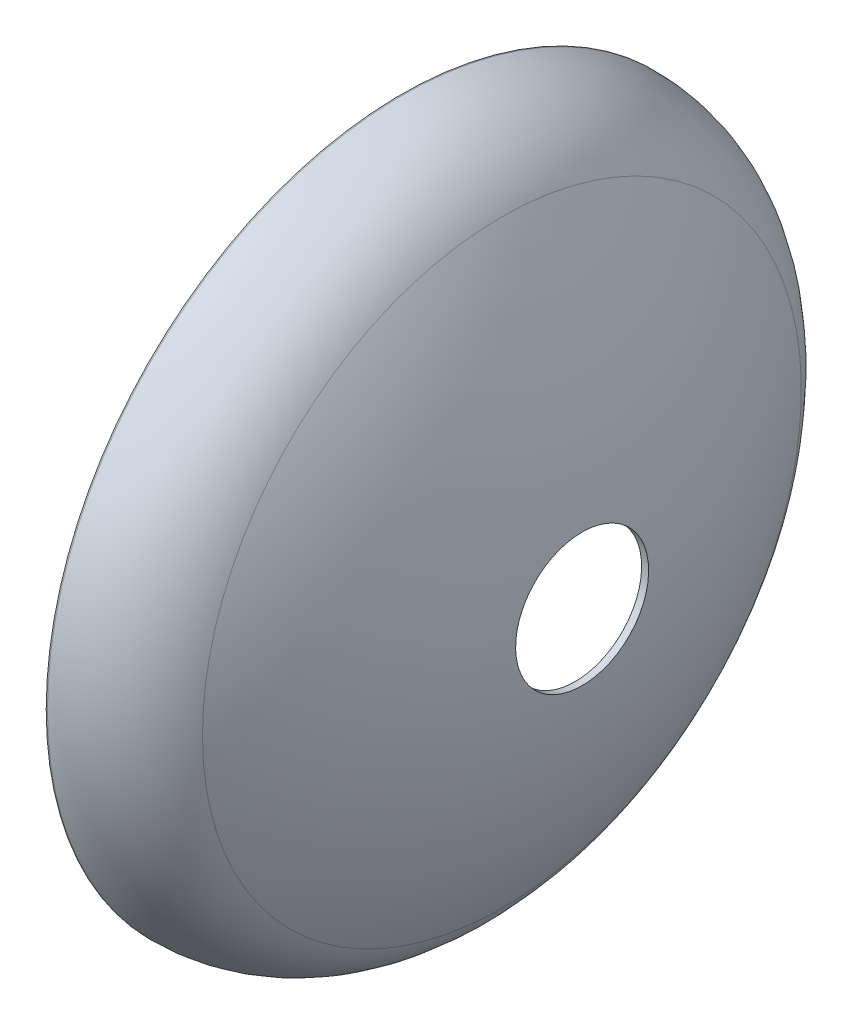
ISO-10303-21;
HEADER;
FILE_DESCRIPTION(('STEP AP214'),'2;1');
FILE_NAME('part.step','',(''),(''),'','','');
FILE_SCHEMA(('AUTOMOTIVE_DESIGN { 1 0 10303 214 1 1 1 1 }'));
ENDSEC;
DATA;
#1=APPLICATION_CONTEXT('core data for automotive mechanical design processes');
#2=APPLICATION_PROTOCOL_DEFINITION('international standard','automotive_design',2000,#1);
#3=PRODUCT_CONTEXT('',#1,'mechanical');
#4=PRODUCT('Part','Part','',(#3));
#5=PRODUCT_RELATED_PRODUCT_CATEGORY('part','',(#4));
#6=PRODUCT_DEFINITION_FORMATION('','',#4);
#7=PRODUCT_DEFINITION_CONTEXT('part definition',#1,'design');
#8=PRODUCT_DEFINITION('design','',#6,#7);
#9=PRODUCT_DEFINITION_SHAPE('','',#8);
#10=(LENGTH_UNIT() NAMED_UNIT(*) SI_UNIT(.MILLI.,.METRE.));
#11=(NAMED_UNIT(*) PLANE_ANGLE_UNIT() SI_UNIT($,.RADIAN.));
#12=(NAMED_UNIT(*) SI_UNIT($,.STERADIAN.) SOLID_ANGLE_UNIT());
#13=UNCERTAINTY_MEASURE_WITH_UNIT(LENGTH_MEASURE(1.E-05),#10,'distance_accuracy_value','');
#14=(GEOMETRIC_REPRESENTATION_CONTEXT(3) GLOBAL_UNCERTAINTY_ASSIGNED_CONTEXT((#13)) GLOBAL_UNIT_ASSIGNED_CONTEXT((#10,
#11,#12)) REPRESENTATION_CONTEXT('',''));
#15=CARTESIAN_POINT('',(0.,0.,0.));
#16=DIRECTION('',(0.,0.,1.));
#17=DIRECTION('',(1.,0.,0.));
#18=AXIS2_PLACEMENT_3D('',#15,#16,#17);
#19=CARTESIAN_POINT('',(0.348765499158729,0.,0.));
#20=DIRECTION('',(-1.,0.,0.));
#21=DIRECTION('',(0.,0.,1.));
#22=AXIS2_PLACEMENT_3D('',#19,#20,#21);
#23=TOROIDAL_SURFACE('',#22,68.6153846153846,31.3846153846154);
#24=CARTESIAN_POINT('',(27.146090618006,0.,0.));
#25=DIRECTION('',(-1.,0.,0.));
#26=DIRECTION('',(0.,0.,1.));
#27=AXIS2_PLACEMENT_3D('',#24,#25,#26);
#28=CIRCLE('',#27,84.9523809523809);
#29=CARTESIAN_POINT('',(27.146090618006,84.952380952381,0.));
#30=VERTEX_POINT('',#29);
#31=EDGE_CURVE('E10',#30,#30,#28,.T.);
#32=ORIENTED_EDGE('',*,*,#31,.F.);
#33=EDGE_LOOP('',(#32));
#34=FACE_BOUND('',#33,.T.);
#35=CARTESIAN_POINT('',(0.348765499158729,0.,0.));
#36=DIRECTION('',(-1.,0.,0.));
#37=DIRECTION('',(0.,0.,1.));
#38=AXIS2_PLACEMENT_3D('',#35,#36,#37);
#39=CIRCLE('',#38,100.);
#40=CARTESIAN_POINT('',(0.348765499158729,0.,100.));
#41=VERTEX_POINT('',#40);
#42=EDGE_CURVE('E65',#41,#41,#39,.T.);
#43=ORIENTED_EDGE('',*,*,#42,.T.);
#44=EDGE_LOOP('',(#43));
#45=FACE_BOUND('',#44,.T.);
#46=ADVANCED_FACE('F37',(#34,#45),#23,.F.);
#47=CARTESIAN_POINT('',(-112.2,0.,0.));
#48=DIRECTION('',(-1.,0.,0.));
#49=DIRECTION('',(0.,1.,0.));
#50=AXIS2_PLACEMENT_3D('',#47,#48,#49);
#51=SPHERICAL_SURFACE('',#50,163.2);
#52=CARTESIAN_POINT('',(49.8784686502189,0.,0.));
#53=DIRECTION('',(-1.,0.,0.));
#54=DIRECTION('',(0.,0.,1.));
#55=AXIS2_PLACEMENT_3D('',#52,#53,#54);
#56=CIRCLE('',#55,19.1);
#57=CARTESIAN_POINT('',(49.8784686502189,19.1000000000002,0.));
#58=VERTEX_POINT('',#57);
#59=EDGE_CURVE('E43',#58,#58,#56,.T.);
#60=CARTESIAN_POINT('',(49.8784686502189,19.1000000000002,0.));
#61=CARTESIAN_POINT('',(49.7928806849767,19.8262836858726,0.));
#62=CARTESIAN_POINT('',(49.7024103154685,20.5519920014663,0.));
#63=CARTESIAN_POINT('',(49.5117225066272,22.0021269272937,0.));
#64=CARTESIAN_POINT('',(49.4115050672941,22.7265535375276,0.));
#65=CARTESIAN_POINT('',(49.2013408575101,24.1739940878335,0.));
#66=CARTESIAN_POINT('',(49.0913940870591,24.8970080279055,0.));
#67=CARTESIAN_POINT('',(48.8617911839781,26.3414925904424,0.));
#68=CARTESIAN_POINT('',(48.7421350513479,27.0629632129072,0.));
#69=CARTESIAN_POINT('',(48.4931350210225,28.5042307550573,0.));
#70=CARTESIAN_POINT('',(48.3637911233272,29.2240276747426,0.));
#71=CARTESIAN_POINT('',(48.0954389446111,30.6618177330828,0.));
#72=CARTESIAN_POINT('',(47.9564306635903,31.3798108717379,0.));
#73=CARTESIAN_POINT('',(47.6687748373969,32.8138636145462,0.));
#74=CARTESIAN_POINT('',(47.5201272922243,33.5299232186994,0.));
#75=CARTESIAN_POINT('',(47.2132198013079,34.959979488774,0.));
#76=CARTESIAN_POINT('',(47.0549598555642,35.6739761546954,0.));
#77=CARTESIAN_POINT('',(46.7288561635541,37.0997775172975,0.));
#78=CARTESIAN_POINT('',(46.5610124172878,37.8115822139783,0.));
#79=CARTESIAN_POINT('',(46.2157714564065,39.2328710032384,0.));
#80=CARTESIAN_POINT('',(46.0383742417916,39.9423550958178,0.));
#81=CARTESIAN_POINT('',(45.6740584028102,41.3588744613798,0.));
#82=CARTESIAN_POINT('',(45.4871397784437,42.0659097343624,0.));
#83=CARTESIAN_POINT('',(45.1038148992444,43.4774036877792,0.));
#84=CARTESIAN_POINT('',(44.9074086444116,44.1818623682135,0.));
#85=CARTESIAN_POINT('',(44.5051439981334,45.5880758292143,0.));
#86=CARTESIAN_POINT('',(44.299285606688,46.2898306097809,0.));
#87=CARTESIAN_POINT('',(43.8781538891962,47.6905094523668,0.));
#88=CARTESIAN_POINT('',(43.6628805631498,48.3894335143861,0.));
#89=CARTESIAN_POINT('',(43.2229578799018,49.7843246127551,0.));
#90=CARTESIAN_POINT('',(42.9983085227001,50.4802916491049,0.));
#91=CARTESIAN_POINT('',(42.5396743749909,51.8691429233961,0.));
#92=CARTESIAN_POINT('',(42.3056895844833,52.5620271613376,0.));
#93=CARTESIAN_POINT('',(41.8284268550786,53.944587623186,0.));
#94=CARTESIAN_POINT('',(41.5851489161816,54.6342638470929,0.));
#95=CARTESIAN_POINT('',(41.0893438543396,56.0102836449873,0.));
#96=CARTESIAN_POINT('',(40.8368167313948,56.6966272189747,0.));
#97=CARTESIAN_POINT('',(40.3225589372795,58.0658576834097,0.));
#98=CARTESIAN_POINT('',(40.0608282661091,58.7487445738574,0.));
#99=CARTESIAN_POINT('',(39.5282106745979,60.1109382622726,0.));
#100=CARTESIAN_POINT('',(39.2573237542572,60.7902450602401,0.));
#101=CARTESIAN_POINT('',(38.706442618146,62.1451558017365,0.));
#102=CARTESIAN_POINT('',(38.4264484023756,62.8207597452653,0.));
#103=CARTESIAN_POINT('',(37.8574032749851,64.1681426850929,0.));
#104=CARTESIAN_POINT('',(37.5683523633651,64.8399216813918,0.));
#105=CARTESIAN_POINT('',(36.9812460805471,66.1795333251978,0.));
#106=CARTESIAN_POINT('',(36.6831907093491,66.8473659727049,0.));
#107=CARTESIAN_POINT('',(36.0781293709125,68.1789642305424,0.));
#108=CARTESIAN_POINT('',(35.7711234036737,68.8427298408729,0.));
#109=CARTESIAN_POINT('',(35.1482163541726,70.1660740709289,0.));
#110=CARTESIAN_POINT('',(34.8323152719102,70.8256526906544,0.));
#111=CARTESIAN_POINT('',(34.1916750810246,72.1405037428205,0.));
#112=CARTESIAN_POINT('',(33.8669359724015,72.7957761752611,0.));
#113=CARTESIAN_POINT('',(33.2086784140686,74.1018964340415,0.));
#114=CARTESIAN_POINT('',(32.875159964359,74.7527442603814,0.));
#115=CARTESIAN_POINT('',(32.1994039978116,76.0498976889932,0.));
#116=CARTESIAN_POINT('',(31.8571664809739,76.6962032912652,0.));
#117=CARTESIAN_POINT('',(31.1640342219255,77.9841554699675,0.));
#118=CARTESIAN_POINT('',(30.8131394797148,78.6258020463977,0.));
#119=CARTESIAN_POINT('',(30.1027562055983,79.9043202310029,0.));
#120=CARTESIAN_POINT('',(29.7432676736925,80.5411918391778,0.));
#121=CARTESIAN_POINT('',(29.0157616991091,81.8100449428464,0.));
#122=CARTESIAN_POINT('',(28.6477442564316,82.4420264383402,0.));
#123=CARTESIAN_POINT('',(27.9032472903012,83.7009852982589,0.));
#124=CARTESIAN_POINT('',(27.5267677668484,84.327962662684,0.));
#125=CARTESIAN_POINT('',(27.146090618006,84.952380952381,0.));
#126=B_SPLINE_CURVE_WITH_KNOTS('',3,(#60,#61,#62,#63,#64,#65,#66,#67,#68,#69,#70,#71,#72,#73,
#74,#75,#76,#77,#78,#79,#80,#81,#82,#83,#84,#85,#86,#87,#88,#89,#90,#91,#92,#93,#94,#95,#96,#97,
#98,#99,#100,#101,#102,#103,#104,#105,#106,#107,#108,#109,#110,#111,#112,#113,#114,#115,#116,
#117,#118,#119,#120,#121,#122,#123,#124,#125),.UNSPECIFIED.,.F.,.F.,(4,2,2,2,2,2,2,2,2,2,2,2,2,
2,2,2,2,2,2,2,2,2,2,2,2,2,2,2,2,2,2,2,4),(0.,2.19391136714156,4.38782273428312,6.58173410142467,
8.77564546856623,10.9695568357078,13.1634682028493,15.3573795699909,17.5512909371325,
19.7452023042741,21.9391136714156,24.1330250385572,26.3269364056987,28.5208477728403,
30.7147591399818,32.9086705071234,35.102581874265,37.2964932414065,39.4904046085481,
41.6843159756896,43.8782273428312,46.0721387099728,48.2660500771144,50.4599614442559,
52.6538728113975,54.847784178539,57.0416955456806,59.2356069128221,61.4295182799637,
63.6234296471053,65.8173410142468,68.0112523813884,70.2051637485299),.UNSPECIFIED.);
#127=EDGE_CURVE('BSEAM94',#58,#30,#126,.T.);
#128=ORIENTED_EDGE('',*,*,#59,.F.);
#129=ORIENTED_EDGE('',*,*,#31,.T.);
#130=ORIENTED_EDGE('',*,*,#127,.T.);
#131=ORIENTED_EDGE('',*,*,#127,.F.);
#132=EDGE_LOOP('',(#128,#130,#129,#131));
#133=FACE_BOUND('',#132,.T.);
#134=ADVANCED_FACE('F94',(#133),#51,.F.);
#135=CARTESIAN_POINT('',(0.,0.,0.));
#136=DIRECTION('',(-1.,0.,0.));
#137=DIRECTION('',(0.,0.,1.));
#138=AXIS2_PLACEMENT_3D('',#135,#136,#137);
#139=CYLINDRICAL_SURFACE('',#138,19.1);
#140=CARTESIAN_POINT('',(51.8921387513735,0.,0.));
#141=DIRECTION('',(-1.,0.,0.));
#142=DIRECTION('',(0.,0.,1.));
#143=AXIS2_PLACEMENT_3D('',#140,#141,#142);
#144=CIRCLE('',#143,19.1);
#145=CARTESIAN_POINT('',(51.8921387513735,19.1,0.));
#146=VERTEX_POINT('',#145);
#147=EDGE_CURVE('E47',#146,#146,#144,.T.);
#148=ORIENTED_EDGE('',*,*,#147,.F.);
#149=EDGE_LOOP('',(#148));
#150=FACE_BOUND('',#149,.T.);
#151=ORIENTED_EDGE('',*,*,#59,.T.);
#152=EDGE_LOOP('',(#151));
#153=FACE_BOUND('',#152,.T.);
#154=ADVANCED_FACE('F99',(#150,#153),#139,.F.);
#155=CARTESIAN_POINT('',(-112.2,0.,0.));
#156=DIRECTION('',(-1.,0.,0.));
#157=DIRECTION('',(0.,1.,0.));
#158=AXIS2_PLACEMENT_3D('',#155,#156,#157);
#159=SPHERICAL_SURFACE('',#158,165.2);
#160=CARTESIAN_POINT('',(28.8537632971483,0.,0.));
#161=DIRECTION('',(-1.,0.,0.));
#162=DIRECTION('',(0.,0.,1.));
#163=AXIS2_PLACEMENT_3D('',#160,#161,#162);
#164=CIRCLE('',#163,85.9934640522876);
#165=CARTESIAN_POINT('',(28.8537632971483,85.9934640522875,0.));
#166=VERTEX_POINT('',#165);
#167=EDGE_CURVE('E51',#166,#166,#164,.T.);
#168=CARTESIAN_POINT('',(51.8921387513735,19.1,0.));
#169=CARTESIAN_POINT('',(51.8062669672911,19.837745484928,0.));
#170=CARTESIAN_POINT('',(51.7154192768811,20.5749117765172,0.));
#171=CARTESIAN_POINT('',(51.5237900353965,22.0479520552998,0.));
#172=CARTESIAN_POINT('',(51.4230084843219,22.7838260424932,0.));
#173=CARTESIAN_POINT('',(51.2115294734989,24.254147794766,0.));
#174=CARTESIAN_POINT('',(51.1008320137506,24.9885955598453,0.));
#175=CARTESIAN_POINT('',(50.8695414256655,26.4559312726187,0.));
#176=CARTESIAN_POINT('',(50.7489482973286,27.1888192203126,0.));
#177=CARTESIAN_POINT('',(50.4978882825959,28.6529019699224,0.));
#178=CARTESIAN_POINT('',(50.3674213962001,29.3840967718382,0.));
#179=CARTESIAN_POINT('',(50.0966376068495,30.8446602140335,0.));
#180=CARTESIAN_POINT('',(49.9563207038947,31.5740288543131,0.));
#181=CARTESIAN_POINT('',(49.6658624054972,33.0308072883763,0.));
#182=CARTESIAN_POINT('',(49.5157210100544,33.7582170821598,0.));
#183=CARTESIAN_POINT('',(49.2056410404906,35.2109454950432,0.));
#184=CARTESIAN_POINT('',(49.0457024663695,35.9362641141431,0.));
#185=CARTESIAN_POINT('',(48.7160572348642,37.384678229805,0.));
#186=CARTESIAN_POINT('',(48.5463505774798,38.1077737263671,0.));
#187=CARTESIAN_POINT('',(48.1972000520231,39.5516100535464,0.));
#188=CARTESIAN_POINT('',(48.0177561839507,40.2723508841637,0.));
#189=CARTESIAN_POINT('',(47.6491638810099,41.7113467643941,0.));
#190=CARTESIAN_POINT('',(47.4600154461414,42.4296018140073,0.));
#191=CARTESIAN_POINT('',(47.0720484189397,43.863495469378,0.));
#192=CARTESIAN_POINT('',(46.8732298266065,44.5791340751355,0.));
#193=CARTESIAN_POINT('',(46.4659586529695,46.0076646559185,0.));
#194=CARTESIAN_POINT('',(46.2575060716659,46.720556630944,0.));
#195=CARTESIAN_POINT('',(45.8310048411706,48.1434642630459,0.));
#196=CARTESIAN_POINT('',(45.612956191979,48.8534799201223,0.));
#197=CARTESIAN_POINT('',(45.1673024924784,50.2705057523602,0.));
#198=CARTESIAN_POINT('',(44.9396974421695,50.9775159275216,0.));
#199=CARTESIAN_POINT('',(44.4749723456775,52.3884021787121,0.));
#200=CARTESIAN_POINT('',(44.2378522994944,53.0922782547412,0.));
#201=CARTESIAN_POINT('',(43.7541403474375,54.4967682605957,0.));
#202=CARTESIAN_POINT('',(43.5075484415636,55.1973821904211,0.));
#203=CARTESIAN_POINT('',(43.0049376294013,56.5952204502371,0.));
#204=CARTESIAN_POINT('',(42.7489187231129,57.2924447802277,0.));
#205=CARTESIAN_POINT('',(42.2275004843301,58.6833770033689,0.));
#206=CARTESIAN_POINT('',(41.9621011518356,59.3770848965195,0.));
#207=CARTESIAN_POINT('',(41.4219703413089,60.7608580486754,0.));
#208=CARTESIAN_POINT('',(41.1472388632766,61.4509233076808,0.));
#209=CARTESIAN_POINT('',(40.5884937400188,62.8272856568983,0.));
#210=CARTESIAN_POINT('',(40.3044800947933,63.5135827471104,0.));
#211=CARTESIAN_POINT('',(39.7272223040788,64.8822839095879,0.));
#212=CARTESIAN_POINT('',(39.4339781585898,65.5646879818534,0.));
#213=CARTESIAN_POINT('',(38.8383127134611,66.925478967489,0.));
#214=CARTESIAN_POINT('',(38.5358914138213,67.6038658808591,0.));
#215=CARTESIAN_POINT('',(37.9219266759955,68.9564991385516,0.));
#216=CARTESIAN_POINT('',(37.6103832378095,69.630745482874,0.));
#217=CARTESIAN_POINT('',(36.9782308979269,70.9749749455343,0.));
#218=CARTESIAN_POINT('',(36.6576219962303,71.6449580638722,0.));
#219=CARTESIAN_POINT('',(36.0073970536803,72.9805391932721,0.));
#220=CARTESIAN_POINT('',(35.6777810128269,73.6461372043342,0.));
#221=CARTESIAN_POINT('',(35.0096017542886,74.9728270352739,0.));
#222=CARTESIAN_POINT('',(34.6710385366039,75.6339188551514,0.));
#223=CARTESIAN_POINT('',(33.9850265165393,76.9514760408476,0.));
#224=CARTESIAN_POINT('',(33.6375777141595,77.6079414066662,0.));
#225=CARTESIAN_POINT('',(32.9338577251947,78.9161262582196,0.));
#226=CARTESIAN_POINT('',(32.5775865386097,79.5678457439544,0.));
#227=CARTESIAN_POINT('',(31.8562866168441,80.866420290516,0.));
#228=CARTESIAN_POINT('',(31.4912578816635,81.5132753513429,0.));
#229=CARTESIAN_POINT('',(30.7525091788396,82.8020033215914,0.));
#230=CARTESIAN_POINT('',(30.3787892111962,83.4438762310132,0.));
#231=CARTESIAN_POINT('',(29.6227263609831,84.722523326828,0.));
#232=CARTESIAN_POINT('',(29.2403834784132,85.3592975132209,0.));
#233=CARTESIAN_POINT('',(28.8537632971483,85.9934640522875,0.));
#234=B_SPLINE_CURVE_WITH_KNOTS('',3,(#168,#169,#170,#171,#172,#173,#174,#175,#176,#177,#178,
#179,#180,#181,#182,#183,#184,#185,#186,#187,#188,#189,#190,#191,#192,#193,#194,#195,#196,#197,
#198,#199,#200,#201,#202,#203,#204,#205,#206,#207,#208,#209,#210,#211,#212,#213,#214,#215,#216,
#217,#218,#219,#220,#221,#222,#223,#224,#225,#226,#227,#228,#229,#230,#231,#232,#233),
.UNSPECIFIED.,.F.,.F.,(4,2,2,2,2,2,2,2,2,2,2,2,2,2,2,2,2,2,2,2,2,2,2,2,2,2,2,2,2,2,2,2,4),(0.,
2.22816201200992,4.45632402401983,6.6844860360297,8.91264804803962,11.1408100600495,
13.3689720720594,15.5971340840694,17.8252960960792,20.0534581080891,22.281620120099,
24.509782132109,26.7379441441189,28.9661061561288,31.1942681681387,33.4224301801486,
35.6505921921585,37.8787542041684,40.1069162161783,42.3350782281882,44.5632402401981,
46.791402252208,49.0195642642179,51.2477262762278,53.4758882882378,55.7040503002476,
57.9322123122575,60.1603743242675,62.3885363362774,64.6166983482873,66.8448603602971,
69.0730223723071,71.301184384317),.UNSPECIFIED.);
#235=EDGE_CURVE('BSEAM90',#146,#166,#234,.T.);
#236=ORIENTED_EDGE('',*,*,#147,.T.);
#237=ORIENTED_EDGE('',*,*,#167,.F.);
#238=ORIENTED_EDGE('',*,*,#235,.T.);
#239=ORIENTED_EDGE('',*,*,#235,.F.);
#240=EDGE_LOOP('',(#236,#238,#237,#239));
#241=FACE_BOUND('',#240,.T.);
#242=ADVANCED_FACE('F90',(#241),#159,.T.);
#243=CARTESIAN_POINT('',(0.348765499158729,0.,0.));
#244=DIRECTION('',(-1.,0.,0.));
#245=DIRECTION('',(0.,0.,1.));
#246=AXIS2_PLACEMENT_3D('',#243,#244,#245);
#247=TOROIDAL_SURFACE('',#246,68.6153846153846,33.3846153846154);
#248=ORIENTED_EDGE('',*,*,#167,.T.);
#249=EDGE_LOOP('',(#248));
#250=FACE_BOUND('',#249,.T.);
#251=CARTESIAN_POINT('',(0.348765499158729,0.,0.));
#252=DIRECTION('',(-1.,0.,0.));
#253=DIRECTION('',(0.,0.,1.));
#254=AXIS2_PLACEMENT_3D('',#251,#252,#253);
#255=CIRCLE('',#254,102.);
#256=CARTESIAN_POINT('',(0.348765499158729,0.,102.));
#257=VERTEX_POINT('',#256);
#258=EDGE_CURVE('E56',#257,#257,#255,.T.);
#259=ORIENTED_EDGE('',*,*,#258,.F.);
#260=EDGE_LOOP('',(#259));
#261=FACE_BOUND('',#260,.T.);
#262=ADVANCED_FACE('F84',(#250,#261),#247,.T.);
#263=CARTESIAN_POINT('',(0.,0.,0.));
#264=DIRECTION('',(-1.,0.,0.));
#265=DIRECTION('',(0.,0.,1.));
#266=AXIS2_PLACEMENT_3D('',#263,#264,#265);
#267=CYLINDRICAL_SURFACE('',#266,102.);
#268=ORIENTED_EDGE('',*,*,#258,.T.);
#269=EDGE_LOOP('',(#268));
#270=FACE_BOUND('',#269,.T.);
#271=CARTESIAN_POINT('',(0.,0.,0.));
#272=DIRECTION('',(-1.,0.,0.));
#273=DIRECTION('',(0.,0.,1.));
#274=AXIS2_PLACEMENT_3D('',#271,#272,#273);
#275=CIRCLE('',#274,102.);
#276=CARTESIAN_POINT('',(0.,0.,102.));
#277=VERTEX_POINT('',#276);
#278=EDGE_CURVE('E59',#277,#277,#275,.T.);
#279=ORIENTED_EDGE('',*,*,#278,.F.);
#280=EDGE_LOOP('',(#279));
#281=FACE_BOUND('',#280,.T.);
#282=ADVANCED_FACE('F79',(#270,#281),#267,.T.);
#283=CARTESIAN_POINT('',(0.,0.,0.));
#284=DIRECTION('',(1.,0.,0.));
#285=DIRECTION('',(0.,0.,-1.));
#286=AXIS2_PLACEMENT_3D('',#283,#284,#285);
#287=PLANE('',#286);
#288=CARTESIAN_POINT('',(0.,0.,0.));
#289=DIRECTION('',(-1.,0.,0.));
#290=DIRECTION('',(0.,0.,1.));
#291=AXIS2_PLACEMENT_3D('',#288,#289,#290);
#292=CIRCLE('',#291,100.);
#293=CARTESIAN_POINT('',(0.,0.,100.));
#294=VERTEX_POINT('',#293);
#295=EDGE_CURVE('E62',#294,#294,#292,.T.);
#296=ORIENTED_EDGE('',*,*,#295,.F.);
#297=EDGE_LOOP('',(#296));
#298=FACE_BOUND('',#297,.T.);
#299=ORIENTED_EDGE('',*,*,#278,.T.);
#300=EDGE_LOOP('',(#299));
#301=FACE_BOUND('',#300,.T.);
#302=ADVANCED_FACE('F73',(#298,#301),#287,.F.);
#303=CARTESIAN_POINT('',(0.,0.,0.));
#304=DIRECTION('',(-1.,0.,0.));
#305=DIRECTION('',(0.,0.,1.));
#306=AXIS2_PLACEMENT_3D('',#303,#304,#305);
#307=CYLINDRICAL_SURFACE('',#306,100.);
#308=ORIENTED_EDGE('',*,*,#42,.F.);
#309=EDGE_LOOP('',(#308));
#310=FACE_BOUND('',#309,.T.);
#311=ORIENTED_EDGE('',*,*,#295,.T.);
#312=EDGE_LOOP('',(#311));
#313=FACE_BOUND('',#312,.T.);
#314=ADVANCED_FACE('F70',(#310,#313),#307,.F.);
#315=CLOSED_SHELL('',(#46,#134,#154,#242,#262,#282,#302,#314));
#316=MANIFOLD_SOLID_BREP('B2',#315);
#317=ADVANCED_BREP_SHAPE_REPRESENTATION('',(#18,#316),#14);
#318=SHAPE_DEFINITION_REPRESENTATION(#9,#317);
ENDSEC;
END-ISO-10303-21;
